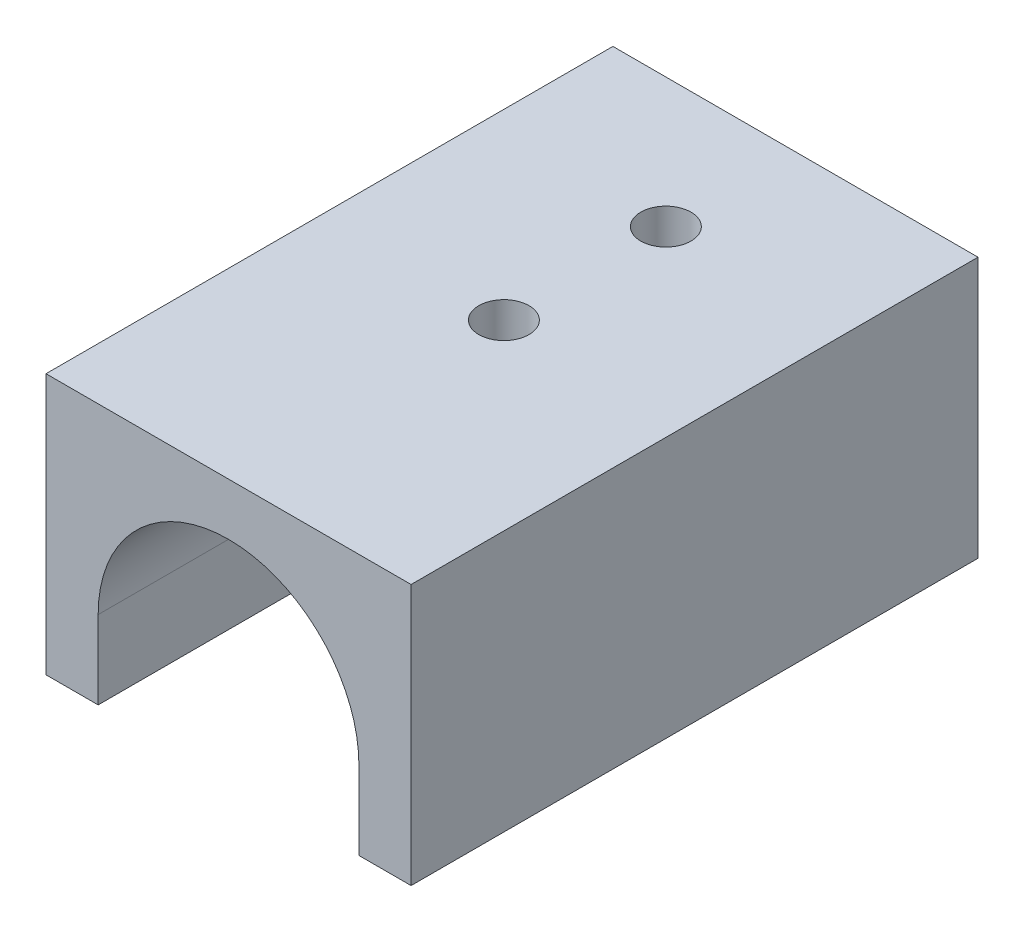
ISO-10303-21;
HEADER;
FILE_DESCRIPTION(('STEP AP214'),'2;1');
FILE_NAME('part.step','',(''),(''),'','','');
FILE_SCHEMA(('AUTOMOTIVE_DESIGN { 1 0 10303 214 1 1 1 1 }'));
ENDSEC;
DATA;
#1=APPLICATION_CONTEXT('core data for automotive mechanical design processes');
#2=APPLICATION_PROTOCOL_DEFINITION('international standard','automotive_design',2000,#1);
#3=PRODUCT_CONTEXT('',#1,'mechanical');
#4=PRODUCT('Part','Part','',(#3));
#5=PRODUCT_RELATED_PRODUCT_CATEGORY('part','',(#4));
#6=PRODUCT_DEFINITION_FORMATION('','',#4);
#7=PRODUCT_DEFINITION_CONTEXT('part definition',#1,'design');
#8=PRODUCT_DEFINITION('design','',#6,#7);
#9=PRODUCT_DEFINITION_SHAPE('','',#8);
#10=(LENGTH_UNIT() NAMED_UNIT(*) SI_UNIT(.MILLI.,.METRE.));
#11=(NAMED_UNIT(*) PLANE_ANGLE_UNIT() SI_UNIT($,.RADIAN.));
#12=(NAMED_UNIT(*) SI_UNIT($,.STERADIAN.) SOLID_ANGLE_UNIT());
#13=UNCERTAINTY_MEASURE_WITH_UNIT(LENGTH_MEASURE(1.E-05),#10,'distance_accuracy_value','');
#14=(GEOMETRIC_REPRESENTATION_CONTEXT(3) GLOBAL_UNCERTAINTY_ASSIGNED_CONTEXT((#13)) GLOBAL_UNIT_ASSIGNED_CONTEXT((#10,
#11,#12)) REPRESENTATION_CONTEXT('',''));
#15=CARTESIAN_POINT('',(0.,0.,0.));
#16=DIRECTION('',(0.,0.,1.));
#17=DIRECTION('',(1.,0.,0.));
#18=AXIS2_PLACEMENT_3D('',#15,#16,#17);
#19=CARTESIAN_POINT('',(-11.27,11.27,17.5));
#20=DIRECTION('',(1.,0.,0.));
#21=DIRECTION('',(0.,0.,-1.));
#22=AXIS2_PLACEMENT_3D('',#19,#20,#21);
#23=PLANE('',#22);
#24=DIRECTION('',(0.,-1.,0.));
#25=VECTOR('',#24,1.);
#26=CARTESIAN_POINT('',(-11.27,11.27,-17.5));
#27=LINE('',#26,#25);
#28=CARTESIAN_POINT('',(-11.27,11.27,-17.5));
#29=VERTEX_POINT('',#28);
#30=CARTESIAN_POINT('',(-11.27,-4.83,-17.5));
#31=VERTEX_POINT('',#30);
#32=EDGE_CURVE('E129',#29,#31,#27,.T.);
#33=ORIENTED_EDGE('',*,*,#32,.T.);
#34=DIRECTION('',(0.,0.,-1.));
#35=VECTOR('',#34,1.);
#36=CARTESIAN_POINT('',(-11.27,-4.83,17.5));
#37=LINE('',#36,#35);
#38=CARTESIAN_POINT('',(-11.27,-4.83,17.5));
#39=VERTEX_POINT('',#38);
#40=EDGE_CURVE('E11',#39,#31,#37,.T.);
#41=ORIENTED_EDGE('',*,*,#40,.F.);
#42=DIRECTION('',(0.,-1.,0.));
#43=VECTOR('',#42,1.);
#44=CARTESIAN_POINT('',(-11.27,11.27,17.5));
#45=LINE('',#44,#43);
#46=CARTESIAN_POINT('',(-11.27,11.27,17.5));
#47=VERTEX_POINT('',#46);
#48=EDGE_CURVE('E144',#47,#39,#45,.T.);
#49=ORIENTED_EDGE('',*,*,#48,.F.);
#50=DIRECTION('',(0.,0.,-1.));
#51=VECTOR('',#50,1.);
#52=CARTESIAN_POINT('',(-11.27,11.27,17.5));
#53=LINE('',#52,#51);
#54=EDGE_CURVE('E125',#47,#29,#53,.T.);
#55=ORIENTED_EDGE('',*,*,#54,.T.);
#56=EDGE_LOOP('',(#33,#41,#49,#55));
#57=FACE_BOUND('',#56,.T.);
#58=ADVANCED_FACE('F33',(#57),#23,.F.);
#59=CARTESIAN_POINT('',(-11.27,-4.83,17.5));
#60=DIRECTION('',(0.,1.,0.));
#61=DIRECTION('',(0.,0.,1.));
#62=AXIS2_PLACEMENT_3D('',#59,#60,#61);
#63=PLANE('',#62);
#64=DIRECTION('',(1.,0.,0.));
#65=VECTOR('',#64,1.);
#66=CARTESIAN_POINT('',(-11.27,-4.83,-17.5));
#67=LINE('',#66,#65);
#68=CARTESIAN_POINT('',(-8.05,-4.83,-17.5));
#69=VERTEX_POINT('',#68);
#70=EDGE_CURVE('E132',#31,#69,#67,.T.);
#71=ORIENTED_EDGE('',*,*,#70,.T.);
#72=DIRECTION('',(0.,0.,-1.));
#73=VECTOR('',#72,1.);
#74=CARTESIAN_POINT('',(-8.05,-4.83,17.5));
#75=LINE('',#74,#73);
#76=CARTESIAN_POINT('',(-8.05,-4.83,17.5));
#77=VERTEX_POINT('',#76);
#78=EDGE_CURVE('E41',#77,#69,#75,.T.);
#79=ORIENTED_EDGE('',*,*,#78,.F.);
#80=DIRECTION('',(1.,0.,0.));
#81=VECTOR('',#80,1.);
#82=CARTESIAN_POINT('',(-11.27,-4.83,17.5));
#83=LINE('',#82,#81);
#84=EDGE_CURVE('E92',#39,#77,#83,.T.);
#85=ORIENTED_EDGE('',*,*,#84,.F.);
#86=ORIENTED_EDGE('',*,*,#40,.T.);
#87=EDGE_LOOP('',(#71,#79,#85,#86));
#88=FACE_BOUND('',#87,.T.);
#89=ADVANCED_FACE('F211',(#88),#63,.F.);
#90=CARTESIAN_POINT('',(-8.05,-4.83,17.5));
#91=DIRECTION('',(-1.,0.,0.));
#92=DIRECTION('',(0.,-1.,0.));
#93=AXIS2_PLACEMENT_3D('',#90,#91,#92);
#94=PLANE('',#93);
#95=DIRECTION('',(0.,1.,0.));
#96=VECTOR('',#95,1.);
#97=CARTESIAN_POINT('',(-8.05,-4.83,-17.5));
#98=LINE('',#97,#96);
#99=CARTESIAN_POINT('',(-8.05,0.,-17.5));
#100=VERTEX_POINT('',#99);
#101=EDGE_CURVE('E135',#69,#100,#98,.T.);
#102=ORIENTED_EDGE('',*,*,#101,.T.);
#103=DIRECTION('',(0.,0.,-1.));
#104=VECTOR('',#103,1.);
#105=CARTESIAN_POINT('',(-8.05,0.,17.5));
#106=LINE('',#105,#104);
#107=CARTESIAN_POINT('',(-8.05,0.,17.5));
#108=VERTEX_POINT('',#107);
#109=EDGE_CURVE('E151',#108,#100,#106,.T.);
#110=ORIENTED_EDGE('',*,*,#109,.F.);
#111=DIRECTION('',(0.,1.,0.));
#112=VECTOR('',#111,1.);
#113=CARTESIAN_POINT('',(-8.05,-4.83,17.5));
#114=LINE('',#113,#112);
#115=EDGE_CURVE('E159',#77,#108,#114,.T.);
#116=ORIENTED_EDGE('',*,*,#115,.F.);
#117=ORIENTED_EDGE('',*,*,#78,.T.);
#118=EDGE_LOOP('',(#102,#110,#116,#117));
#119=FACE_BOUND('',#118,.T.);
#120=ADVANCED_FACE('F157',(#119),#94,.F.);
#121=CARTESIAN_POINT('',(0.,0.,17.5));
#122=DIRECTION('',(0.,0.,-1.));
#123=DIRECTION('',(-1.,0.,0.));
#124=AXIS2_PLACEMENT_3D('',#121,#122,#123);
#125=CYLINDRICAL_SURFACE('',#124,8.05);
#126=CARTESIAN_POINT('',(0.,8.05,-7.95));
#127=CARTESIAN_POINT('',(-0.0862105618547308,8.04999842535356,-7.95000324717469));
#128=CARTESIAN_POINT('',(-0.172462890865495,8.04860084138752,-7.95721681458772));
#129=CARTESIAN_POINT('',(-0.342534050927733,8.04316034808383,-7.9858601955511));
#130=CARTESIAN_POINT('',(-0.426350816436114,8.03911525812303,-8.00730172819297));
#131=CARTESIAN_POINT('',(-0.589066917277874,8.028831929586,-8.06371776058672));
#132=CARTESIAN_POINT('',(-0.667970722481068,8.02259571988153,-8.0986797440539));
#133=CARTESIAN_POINT('',(-0.818785982822765,8.00860992717729,-8.18110804014874));
#134=CARTESIAN_POINT('',(-0.890697943867393,8.00086045379441,-8.22857344714786));
#135=CARTESIAN_POINT('',(-1.02640068852056,7.98459335824925,-8.33529565296864));
#136=CARTESIAN_POINT('',(-1.09009066940898,7.97606805460606,-8.39467946974094));
#137=CARTESIAN_POINT('',(-1.20666916890539,7.95926671598186,-8.52327964564308));
#138=CARTESIAN_POINT('',(-1.2595568853207,7.95099069955217,-8.59249673436004));
#139=CARTESIAN_POINT('',(-1.35345272022025,7.93555017933453,-8.73951606264995));
#140=CARTESIAN_POINT('',(-1.39435756907978,7.92839557164992,-8.81738538772583));
#141=CARTESIAN_POINT('',(-1.46246524601047,7.91611651970756,-8.97905181644173));
#142=CARTESIAN_POINT('',(-1.48966932346081,7.91099189034433,-9.0628483787794));
#143=CARTESIAN_POINT('',(-1.52927823684157,7.90343050153308,-9.23290963468623));
#144=CARTESIAN_POINT('',(-1.54185929407301,7.9009617636582,-9.31913183425275));
#145=CARTESIAN_POINT('',(-1.55241216873096,7.89889532870698,-9.49249588874146));
#146=CARTESIAN_POINT('',(-1.55038536876949,7.89929735991657,-9.57963765584838));
#147=CARTESIAN_POINT('',(-1.53192279014981,7.90289794765431,-9.75108554299766));
#148=CARTESIAN_POINT('',(-1.51568803902102,7.90605748665065,-9.83541425184964));
#149=CARTESIAN_POINT('',(-1.46958727888704,7.91475574431484,-10.0001282523838));
#150=CARTESIAN_POINT('',(-1.43972066209151,7.92029456906488,-10.08051336806));
#151=CARTESIAN_POINT('',(-1.36700922262734,7.93316774424294,-10.2356430254333));
#152=CARTESIAN_POINT('',(-1.32408382034174,7.94051318696532,-10.310348839801));
#153=CARTESIAN_POINT('',(-1.22653023954093,7.95616470245715,-10.4515728150637));
#154=CARTESIAN_POINT('',(-1.1719008108292,7.96447087780617,-10.5180901000832));
#155=CARTESIAN_POINT('',(-1.05140903517778,7.98127758544892,-10.6422097252475));
#156=CARTESIAN_POINT('',(-0.985374888627045,7.98977905185996,-10.699645290741));
#157=CARTESIAN_POINT('',(-0.844521444261749,8.00589159406762,-10.8026495381875));
#158=CARTESIAN_POINT('',(-0.769702049016871,8.01350265998762,-10.8482180885146));
#159=CARTESIAN_POINT('',(-0.613223518097822,8.02699349400927,-10.9262218345862));
#160=CARTESIAN_POINT('',(-0.53155517830898,8.03287088278746,-10.9586390038627));
#161=CARTESIAN_POINT('',(-0.363793654511978,8.04221389056684,-11.0092475283378));
#162=CARTESIAN_POINT('',(-0.277700967790043,8.045679779981,-11.0274404785945));
#163=CARTESIAN_POINT('',(-0.104968765806848,8.04977192897762,-11.0488504237753));
#164=CARTESIAN_POINT('',(-0.0183585534198852,8.05044149171355,-11.0522958164239));
#165=CARTESIAN_POINT('',(0.15420023036194,8.04898542476023,-11.044726469398));
#166=CARTESIAN_POINT('',(0.240148835881382,8.04685994021979,-11.0337124806095));
#167=CARTESIAN_POINT('',(0.408215286186795,8.04007961834028,-10.9977268561192));
#168=CARTESIAN_POINT('',(0.490358938090241,8.03544584944033,-10.9728714327875));
#169=CARTESIAN_POINT('',(0.649312942020345,8.0241664748914,-10.9100347408302));
#170=CARTESIAN_POINT('',(0.726122916304132,8.01752072692788,-10.8720525436737));
#171=CARTESIAN_POINT('',(0.873199403178565,8.00284659026074,-10.7835394954193));
#172=CARTESIAN_POINT('',(0.943380891661179,7.99480323692781,-10.7328698974978));
#173=CARTESIAN_POINT('',(1.07432694460329,7.97826331559568,-10.6206073358215));
#174=CARTESIAN_POINT('',(1.13509057720513,7.96976670286001,-10.5590132924298));
#175=CARTESIAN_POINT('',(1.24634935107676,7.95313330642179,-10.4256139530047));
#176=CARTESIAN_POINT('',(1.29668825024846,7.94500325431531,-10.353677365463));
#177=CARTESIAN_POINT('',(1.38456819679623,7.93016174865427,-10.202235185184));
#178=CARTESIAN_POINT('',(1.42210973514521,7.92345024068077,-10.1227298829716));
#179=CARTESIAN_POINT('',(1.48311101600777,7.91225916384547,-9.95879339032262));
#180=CARTESIAN_POINT('',(1.50664077785396,7.90776851638355,-9.87438904621588));
#181=CARTESIAN_POINT('',(1.53916515711876,7.90150301105244,-9.70272983838665));
#182=CARTESIAN_POINT('',(1.54816151480488,7.89972782802785,-9.61547531722848));
#183=CARTESIAN_POINT('',(1.55130301849039,7.89911135872095,-9.44215904727128));
#184=CARTESIAN_POINT('',(1.54569478656281,7.9002213510029,-9.35610184612318));
#185=CARTESIAN_POINT('',(1.52032797718634,7.90514180299883,-9.18618163442649));
#186=CARTESIAN_POINT('',(1.50056949546241,7.90895224444456,-9.10231860903851));
#187=CARTESIAN_POINT('',(1.44756949973569,7.91882323078578,-8.93930959896446));
#188=CARTESIAN_POINT('',(1.41435609646211,7.92487908223142,-8.8601541719256));
#189=CARTESIAN_POINT('',(1.33541655023485,7.93856160380259,-8.70850017041187));
#190=CARTESIAN_POINT('',(1.28968945712629,7.94618839319738,-8.63600210198362));
#191=CARTESIAN_POINT('',(1.18616912257707,7.96230382716423,-8.49848828820187));
#192=CARTESIAN_POINT('',(1.12819693843106,7.97080416830911,-8.43360859784963));
#193=CARTESIAN_POINT('',(1.00220374432662,7.98762285089128,-8.31441606233843));
#194=CARTESIAN_POINT('',(0.934180429347513,7.99594115007725,-8.26010564766332));
#195=CARTESIAN_POINT('',(0.789234632229584,8.01155212364198,-8.16310541273832));
#196=CARTESIAN_POINT('',(0.712233183384229,8.01883421603446,-8.12053182822813));
#197=CARTESIAN_POINT('',(0.55205312901201,8.03144865279726,-8.04899468822523));
#198=CARTESIAN_POINT('',(0.46888031584701,8.03678279831651,-8.02001855288875));
#199=CARTESIAN_POINT('',(0.321237841660569,8.04383306018301,-7.98227498111332));
#200=CARTESIAN_POINT('',(0.25762259056929,8.04613241567164,-7.970192899384));
#201=CARTESIAN_POINT('',(0.129346044698939,8.04921645521134,-7.95405430246493));
#202=CARTESIAN_POINT('',(0.0646847791231241,8.05000118147539,-7.94999756360737));
#203=CARTESIAN_POINT('',(0.,8.05,-7.95));
#204=B_SPLINE_CURVE_WITH_KNOTS('',3,(#126,#127,#128,#129,#130,#131,#132,#133,#134,#135,#136,
#137,#138,#139,#140,#141,#142,#143,#144,#145,#146,#147,#148,#149,#150,#151,#152,#153,#154,#155,
#156,#157,#158,#159,#160,#161,#162,#163,#164,#165,#166,#167,#168,#169,#170,#171,#172,#173,#174,
#175,#176,#177,#178,#179,#180,#181,#182,#183,#184,#185,#186,#187,#188,#189,#190,#191,#192,#193,
#194,#195,#196,#197,#198,#199,#200,#201,#202,#203),.UNSPECIFIED.,.T.,.F.,(4,2,2,2,2,2,2,2,2,2,2,
2,2,2,2,2,2,2,2,2,2,2,2,2,2,2,2,2,2,2,2,2,2,2,2,2,2,2,4),(0.,0.258395097758879,
0.517003291398923,0.775372654596524,1.03372330912911,1.29498937540572,1.55627483665118,
1.81974996392261,2.0832010604327,2.34344327917453,2.60366086669988,2.86025511332621,
3.11686080158136,3.37508315303579,3.63333310095805,3.89588060704474,4.15843102511524,
4.4213401123389,4.68421971355392,4.94301298323726,5.20179281413224,5.45843199865001,
5.71508934042511,5.97468638226007,6.23430909376672,6.49757896026993,6.7608387252428,
7.02277164761484,7.28467320313388,7.54218091763953,7.79968689014896,8.05665761966075,
8.31364786617932,8.57469161207224,8.83579531617429,9.09939886830187,9.36275806126957,
9.55664028768916,9.75051711049882),.UNSPECIFIED.);
#205=CARTESIAN_POINT('',(0.,8.05,-7.95));
#206=VERTEX_POINT('',#205);
#207=EDGE_CURVE('E133',#206,#206,#204,.T.);
#208=ORIENTED_EDGE('',*,*,#207,.F.);
#209=EDGE_LOOP('',(#208));
#210=FACE_BOUND('',#209,.T.);
#211=CARTESIAN_POINT('',(0.,8.05,2.05));
#212=CARTESIAN_POINT('',(-0.0862105618547307,8.04999842535356,2.04999675282531));
#213=CARTESIAN_POINT('',(-0.172462890865495,8.04860084138752,2.04278318541228));
#214=CARTESIAN_POINT('',(-0.342534050927733,8.04316034808383,2.0141398044489));
#215=CARTESIAN_POINT('',(-0.426350816436114,8.03911525812303,1.99269827180703));
#216=CARTESIAN_POINT('',(-0.589066917277875,8.028831929586,1.93628223941328));
#217=CARTESIAN_POINT('',(-0.667970722481069,8.02259571988153,1.9013202559461));
#218=CARTESIAN_POINT('',(-0.818785982822765,8.00860992717729,1.81889195985126));
#219=CARTESIAN_POINT('',(-0.890697943867394,8.00086045379441,1.77142655285214));
#220=CARTESIAN_POINT('',(-1.02640068852057,7.98459335824925,1.66470434703136));
#221=CARTESIAN_POINT('',(-1.09009066940899,7.97606805460606,1.60532053025906));
#222=CARTESIAN_POINT('',(-1.20666916890539,7.95926671598186,1.47672035435692));
#223=CARTESIAN_POINT('',(-1.2595568853207,7.95099069955217,1.40750326563996));
#224=CARTESIAN_POINT('',(-1.35345272022025,7.93555017933453,1.26048393735005));
#225=CARTESIAN_POINT('',(-1.39435756907978,7.92839557164992,1.18261461227417));
#226=CARTESIAN_POINT('',(-1.46246524601047,7.91611651970756,1.02094818355827));
#227=CARTESIAN_POINT('',(-1.48966932346081,7.91099189034433,0.937151621220598));
#228=CARTESIAN_POINT('',(-1.52927823684157,7.90343050153308,0.767090365313776));
#229=CARTESIAN_POINT('',(-1.54185929407301,7.9009617636582,0.680868165747249));
#230=CARTESIAN_POINT('',(-1.55241216873096,7.89889532870698,0.507504111258543));
#231=CARTESIAN_POINT('',(-1.55038536876949,7.89929735991657,0.420362344151623));
#232=CARTESIAN_POINT('',(-1.53192279014981,7.90289794765431,0.248914457002344));
#233=CARTESIAN_POINT('',(-1.51568803902102,7.90605748665065,0.164585748150363));
#234=CARTESIAN_POINT('',(-1.46958727888704,7.91475574431484,-0.000128252383841524));
#235=CARTESIAN_POINT('',(-1.43972066209151,7.92029456906488,-0.0805133680600187));
#236=CARTESIAN_POINT('',(-1.36700922262734,7.93316774424294,-0.2356430254333));
#237=CARTESIAN_POINT('',(-1.32408382034174,7.94051318696532,-0.310348839801029));
#238=CARTESIAN_POINT('',(-1.22653023954093,7.95616470245715,-0.451572815063736));
#239=CARTESIAN_POINT('',(-1.1719008108292,7.96447087780617,-0.51809010008317));
#240=CARTESIAN_POINT('',(-1.05140903517778,7.98127758544892,-0.642209725247495));
#241=CARTESIAN_POINT('',(-0.985374888627045,7.98977905185996,-0.699645290741006));
#242=CARTESIAN_POINT('',(-0.84452144426175,8.00589159406762,-0.802649538187484));
#243=CARTESIAN_POINT('',(-0.769702049016872,8.01350265998762,-0.848218088514644));
#244=CARTESIAN_POINT('',(-0.613223518097822,8.02699349400927,-0.926221834586208));
#245=CARTESIAN_POINT('',(-0.531555178308979,8.03287088278746,-0.958639003862689));
#246=CARTESIAN_POINT('',(-0.363793654511978,8.04221389056684,-1.00924752833778));
#247=CARTESIAN_POINT('',(-0.277700967790042,8.045679779981,-1.02744047859451));
#248=CARTESIAN_POINT('',(-0.104968765806848,8.04977192897762,-1.04885042377525));
#249=CARTESIAN_POINT('',(-0.0183585534198846,8.05044149171355,-1.0522958164239));
#250=CARTESIAN_POINT('',(0.154200230361941,8.04898542476023,-1.044726469398));
#251=CARTESIAN_POINT('',(0.240148835881382,8.04685994021979,-1.0337124806095));
#252=CARTESIAN_POINT('',(0.408215286186795,8.04007961834028,-0.997726856119196));
#253=CARTESIAN_POINT('',(0.490358938090241,8.03544584944033,-0.972871432787522));
#254=CARTESIAN_POINT('',(0.649312942020345,8.0241664748914,-0.910034740830219));
#255=CARTESIAN_POINT('',(0.726122916304132,8.01752072692788,-0.872052543673659));
#256=CARTESIAN_POINT('',(0.873199403178566,8.00284659026074,-0.783539495419317));
#257=CARTESIAN_POINT('',(0.943380891661181,7.99480323692781,-0.732869897497753));
#258=CARTESIAN_POINT('',(1.07432694460329,7.97826331559568,-0.620607335821531));
#259=CARTESIAN_POINT('',(1.13509057720513,7.96976670286001,-0.559013292429762));
#260=CARTESIAN_POINT('',(1.24634935107675,7.95313330642179,-0.425613953004681));
#261=CARTESIAN_POINT('',(1.29668825024847,7.94500325431531,-0.353677365462963));
#262=CARTESIAN_POINT('',(1.38456819679623,7.93016174865427,-0.202235185184016));
#263=CARTESIAN_POINT('',(1.42210973514521,7.92345024068077,-0.122729882971558));
#264=CARTESIAN_POINT('',(1.48311101600777,7.91225916384547,0.041206609677379));
#265=CARTESIAN_POINT('',(1.50664077785396,7.90776851638355,0.125610953784121));
#266=CARTESIAN_POINT('',(1.53916515711876,7.90150301105244,0.297270161613347));
#267=CARTESIAN_POINT('',(1.54816151480488,7.89972782802785,0.384524682771519));
#268=CARTESIAN_POINT('',(1.55130301849039,7.89911135872095,0.55784095272872));
#269=CARTESIAN_POINT('',(1.54569478656281,7.9002213510029,0.643898153876821));
#270=CARTESIAN_POINT('',(1.52032797718634,7.90514180299883,0.813818365573511));
#271=CARTESIAN_POINT('',(1.50056949546241,7.90895224444456,0.89768139096149));
#272=CARTESIAN_POINT('',(1.44756949973569,7.91882323078578,1.06069040103554));
#273=CARTESIAN_POINT('',(1.41435609646211,7.92487908223142,1.1398458280744));
#274=CARTESIAN_POINT('',(1.33541655023485,7.93856160380259,1.29149982958813));
#275=CARTESIAN_POINT('',(1.28968945712629,7.94618839319738,1.36399789801638));
#276=CARTESIAN_POINT('',(1.18616912257707,7.96230382716423,1.50151171179813));
#277=CARTESIAN_POINT('',(1.12819693843106,7.97080416830911,1.56639140215037));
#278=CARTESIAN_POINT('',(1.00220374432662,7.98762285089128,1.68558393766158));
#279=CARTESIAN_POINT('',(0.934180429347512,7.99594115007725,1.73989435233668));
#280=CARTESIAN_POINT('',(0.789234632229584,8.01155212364198,1.83689458726168));
#281=CARTESIAN_POINT('',(0.71223318338423,8.01883421603446,1.87946817177187));
#282=CARTESIAN_POINT('',(0.552053129012011,8.03144865279726,1.95100531177477));
#283=CARTESIAN_POINT('',(0.468880315847011,8.03678279831651,1.97998144711125));
#284=CARTESIAN_POINT('',(0.321237841660569,8.04383306018301,2.01772501888668));
#285=CARTESIAN_POINT('',(0.25762259056929,8.04613241567164,2.029807100616));
#286=CARTESIAN_POINT('',(0.129346044698938,8.04921645521134,2.04594569753507));
#287=CARTESIAN_POINT('',(0.0646847791231237,8.05000118147539,2.05000243639263));
#288=CARTESIAN_POINT('',(0.,8.05,2.05));
#289=B_SPLINE_CURVE_WITH_KNOTS('',3,(#211,#212,#213,#214,#215,#216,#217,#218,#219,#220,#221,
#222,#223,#224,#225,#226,#227,#228,#229,#230,#231,#232,#233,#234,#235,#236,#237,#238,#239,#240,
#241,#242,#243,#244,#245,#246,#247,#248,#249,#250,#251,#252,#253,#254,#255,#256,#257,#258,#259,
#260,#261,#262,#263,#264,#265,#266,#267,#268,#269,#270,#271,#272,#273,#274,#275,#276,#277,#278,
#279,#280,#281,#282,#283,#284,#285,#286,#287,#288),.UNSPECIFIED.,.T.,.F.,(4,2,2,2,2,2,2,2,2,2,2,
2,2,2,2,2,2,2,2,2,2,2,2,2,2,2,2,2,2,2,2,2,2,2,2,2,2,2,4),(0.,0.258395097758879,
0.517003291398924,0.775372654596525,1.03372330912911,1.29498937540572,1.55627483665118,
1.81974996392261,2.0832010604327,2.34344327917452,2.60366086669989,2.86025511332621,
3.11686080158136,3.37508315303579,3.63333310095805,3.89588060704474,4.15843102511524,
4.4213401123389,4.68421971355393,4.94301298323726,5.20179281413224,5.45843199865001,
5.71508934042512,5.97468638226008,6.23430909376672,6.49757896026993,6.7608387252428,
7.02277164761484,7.28467320313388,7.54218091763953,7.79968689014896,8.05665761966075,
8.31364786617932,8.57469161207224,8.83579531617429,9.09939886830187,9.36275806126957,
9.55664028768916,9.75051711049882),.UNSPECIFIED.);
#290=CARTESIAN_POINT('',(0.,8.05,2.05));
#291=VERTEX_POINT('',#290);
#292=EDGE_CURVE('E177',#291,#291,#289,.T.);
#293=ORIENTED_EDGE('',*,*,#292,.F.);
#294=EDGE_LOOP('',(#293));
#295=FACE_BOUND('',#294,.T.);
#296=CARTESIAN_POINT('',(0.,0.,-17.5));
#297=DIRECTION('',(0.,0.,-1.));
#298=DIRECTION('',(-1.,0.,0.));
#299=AXIS2_PLACEMENT_3D('',#296,#297,#298);
#300=CIRCLE('',#299,8.05);
#301=CARTESIAN_POINT('',(8.05,0.,-17.5));
#302=VERTEX_POINT('',#301);
#303=EDGE_CURVE('E137',#100,#302,#300,.T.);
#304=ORIENTED_EDGE('',*,*,#303,.T.);
#305=DIRECTION('',(0.,0.,-1.));
#306=VECTOR('',#305,1.);
#307=CARTESIAN_POINT('',(8.05,0.,17.5));
#308=LINE('',#307,#306);
#309=CARTESIAN_POINT('',(8.05,0.,17.5));
#310=VERTEX_POINT('',#309);
#311=EDGE_CURVE('E148',#310,#302,#308,.T.);
#312=ORIENTED_EDGE('',*,*,#311,.F.);
#313=CARTESIAN_POINT('',(0.,0.,17.5));
#314=DIRECTION('',(0.,0.,-1.));
#315=DIRECTION('',(-1.,0.,0.));
#316=AXIS2_PLACEMENT_3D('',#313,#314,#315);
#317=CIRCLE('',#316,8.05);
#318=EDGE_CURVE('E171',#108,#310,#317,.T.);
#319=ORIENTED_EDGE('',*,*,#318,.F.);
#320=ORIENTED_EDGE('',*,*,#109,.T.);
#321=EDGE_LOOP('',(#304,#312,#319,#320));
#322=FACE_BOUND('',#321,.T.);
#323=ADVANCED_FACE('F167',(#210,#295,#322),#125,.F.);
#324=CARTESIAN_POINT('',(8.05,-4.83,17.5));
#325=DIRECTION('',(1.,0.,0.));
#326=DIRECTION('',(0.,1.,0.));
#327=AXIS2_PLACEMENT_3D('',#324,#325,#326);
#328=PLANE('',#327);
#329=DIRECTION('',(0.,-1.,0.));
#330=VECTOR('',#329,1.);
#331=CARTESIAN_POINT('',(8.05,-4.83,-17.5));
#332=LINE('',#331,#330);
#333=CARTESIAN_POINT('',(8.05,-4.83,-17.5));
#334=VERTEX_POINT('',#333);
#335=EDGE_CURVE('E139',#302,#334,#332,.T.);
#336=ORIENTED_EDGE('',*,*,#335,.T.);
#337=DIRECTION('',(0.,0.,-1.));
#338=VECTOR('',#337,1.);
#339=CARTESIAN_POINT('',(8.05,-4.83,17.5));
#340=LINE('',#339,#338);
#341=CARTESIAN_POINT('',(8.05,-4.83,17.5));
#342=VERTEX_POINT('',#341);
#343=EDGE_CURVE('E120',#342,#334,#340,.T.);
#344=ORIENTED_EDGE('',*,*,#343,.F.);
#345=DIRECTION('',(0.,-1.,0.));
#346=VECTOR('',#345,1.);
#347=CARTESIAN_POINT('',(8.05,-4.83,17.5));
#348=LINE('',#347,#346);
#349=EDGE_CURVE('E111',#310,#342,#348,.T.);
#350=ORIENTED_EDGE('',*,*,#349,.F.);
#351=ORIENTED_EDGE('',*,*,#311,.T.);
#352=EDGE_LOOP('',(#336,#344,#350,#351));
#353=FACE_BOUND('',#352,.T.);
#354=ADVANCED_FACE('F170',(#353),#328,.F.);
#355=CARTESIAN_POINT('',(11.27,-4.83,17.5));
#356=DIRECTION('',(0.,1.,0.));
#357=DIRECTION('',(0.,0.,1.));
#358=AXIS2_PLACEMENT_3D('',#355,#356,#357);
#359=PLANE('',#358);
#360=DIRECTION('',(1.,0.,0.));
#361=VECTOR('',#360,1.);
#362=CARTESIAN_POINT('',(11.27,-4.83,-17.5));
#363=LINE('',#362,#361);
#364=CARTESIAN_POINT('',(11.27,-4.83,-17.5));
#365=VERTEX_POINT('',#364);
#366=EDGE_CURVE('E119',#334,#365,#363,.T.);
#367=ORIENTED_EDGE('',*,*,#366,.T.);
#368=DIRECTION('',(0.,0.,-1.));
#369=VECTOR('',#368,1.);
#370=CARTESIAN_POINT('',(11.27,-4.83,17.5));
#371=LINE('',#370,#369);
#372=CARTESIAN_POINT('',(11.27,-4.83,17.5));
#373=VERTEX_POINT('',#372);
#374=EDGE_CURVE('E116',#373,#365,#371,.T.);
#375=ORIENTED_EDGE('',*,*,#374,.F.);
#376=DIRECTION('',(1.,0.,0.));
#377=VECTOR('',#376,1.);
#378=CARTESIAN_POINT('',(11.27,-4.83,17.5));
#379=LINE('',#378,#377);
#380=EDGE_CURVE('E105',#342,#373,#379,.T.);
#381=ORIENTED_EDGE('',*,*,#380,.F.);
#382=ORIENTED_EDGE('',*,*,#343,.T.);
#383=EDGE_LOOP('',(#367,#375,#381,#382));
#384=FACE_BOUND('',#383,.T.);
#385=ADVANCED_FACE('F117',(#384),#359,.F.);
#386=CARTESIAN_POINT('',(11.27,11.27,17.5));
#387=DIRECTION('',(-1.,0.,0.));
#388=DIRECTION('',(0.,0.,1.));
#389=AXIS2_PLACEMENT_3D('',#386,#387,#388);
#390=PLANE('',#389);
#391=DIRECTION('',(0.,1.,0.));
#392=VECTOR('',#391,1.);
#393=CARTESIAN_POINT('',(11.27,11.27,-17.5));
#394=LINE('',#393,#392);
#395=CARTESIAN_POINT('',(11.27,11.27,-17.5));
#396=VERTEX_POINT('',#395);
#397=EDGE_CURVE('E78',#365,#396,#394,.T.);
#398=ORIENTED_EDGE('',*,*,#397,.T.);
#399=DIRECTION('',(0.,0.,-1.));
#400=VECTOR('',#399,1.);
#401=CARTESIAN_POINT('',(11.27,11.27,17.5));
#402=LINE('',#401,#400);
#403=CARTESIAN_POINT('',(11.27,11.27,17.5));
#404=VERTEX_POINT('',#403);
#405=EDGE_CURVE('E121',#404,#396,#402,.T.);
#406=ORIENTED_EDGE('',*,*,#405,.F.);
#407=DIRECTION('',(0.,1.,0.));
#408=VECTOR('',#407,1.);
#409=CARTESIAN_POINT('',(11.27,11.27,17.5));
#410=LINE('',#409,#408);
#411=EDGE_CURVE('E109',#373,#404,#410,.T.);
#412=ORIENTED_EDGE('',*,*,#411,.F.);
#413=ORIENTED_EDGE('',*,*,#374,.T.);
#414=EDGE_LOOP('',(#398,#406,#412,#413));
#415=FACE_BOUND('',#414,.T.);
#416=ADVANCED_FACE('F123',(#415),#390,.F.);
#417=CARTESIAN_POINT('',(-11.27,11.27,17.5));
#418=DIRECTION('',(0.,-1.,0.));
#419=DIRECTION('',(0.,0.,-1.));
#420=AXIS2_PLACEMENT_3D('',#417,#418,#419);
#421=PLANE('',#420);
#422=CARTESIAN_POINT('',(0.,11.27,-9.5));
#423=DIRECTION('',(0.,1.,0.));
#424=DIRECTION('',(0.,0.,1.));
#425=AXIS2_PLACEMENT_3D('',#422,#423,#424);
#426=CIRCLE('',#425,1.55);
#427=CARTESIAN_POINT('',(0.,11.27,-7.95));
#428=VERTEX_POINT('',#427);
#429=EDGE_CURVE('E185',#428,#428,#426,.T.);
#430=ORIENTED_EDGE('',*,*,#429,.F.);
#431=EDGE_LOOP('',(#430));
#432=FACE_BOUND('',#431,.T.);
#433=CARTESIAN_POINT('',(0.,11.27,0.499999999999999));
#434=DIRECTION('',(0.,1.,0.));
#435=DIRECTION('',(0.,0.,1.));
#436=AXIS2_PLACEMENT_3D('',#433,#434,#435);
#437=CIRCLE('',#436,1.55);
#438=CARTESIAN_POINT('',(0.,11.27,2.05));
#439=VERTEX_POINT('',#438);
#440=EDGE_CURVE('E186',#439,#439,#437,.T.);
#441=ORIENTED_EDGE('',*,*,#440,.F.);
#442=EDGE_LOOP('',(#441));
#443=FACE_BOUND('',#442,.T.);
#444=DIRECTION('',(-1.,0.,0.));
#445=VECTOR('',#444,1.);
#446=CARTESIAN_POINT('',(-11.27,11.27,-17.5));
#447=LINE('',#446,#445);
#448=EDGE_CURVE('E84',#396,#29,#447,.T.);
#449=ORIENTED_EDGE('',*,*,#448,.T.);
#450=ORIENTED_EDGE('',*,*,#54,.F.);
#451=DIRECTION('',(-1.,0.,0.));
#452=VECTOR('',#451,1.);
#453=CARTESIAN_POINT('',(-11.27,11.27,17.5));
#454=LINE('',#453,#452);
#455=EDGE_CURVE('E49',#404,#47,#454,.T.);
#456=ORIENTED_EDGE('',*,*,#455,.F.);
#457=ORIENTED_EDGE('',*,*,#405,.T.);
#458=EDGE_LOOP('',(#449,#450,#456,#457));
#459=FACE_BOUND('',#458,.T.);
#460=ADVANCED_FACE('F195',(#432,#443,#459),#421,.F.);
#461=CARTESIAN_POINT('',(0.,0.,17.5));
#462=DIRECTION('',(0.,0.,-1.));
#463=DIRECTION('',(-1.,0.,0.));
#464=AXIS2_PLACEMENT_3D('',#461,#462,#463);
#465=PLANE('',#464);
#466=ORIENTED_EDGE('',*,*,#48,.T.);
#467=ORIENTED_EDGE('',*,*,#84,.T.);
#468=ORIENTED_EDGE('',*,*,#115,.T.);
#469=ORIENTED_EDGE('',*,*,#318,.T.);
#470=ORIENTED_EDGE('',*,*,#349,.T.);
#471=ORIENTED_EDGE('',*,*,#380,.T.);
#472=ORIENTED_EDGE('',*,*,#411,.T.);
#473=ORIENTED_EDGE('',*,*,#455,.T.);
#474=EDGE_LOOP('',(#466,#467,#468,#469,#470,#471,#472,#473));
#475=FACE_BOUND('',#474,.T.);
#476=ADVANCED_FACE('F107',(#475),#465,.F.);
#477=CARTESIAN_POINT('',(0.,0.,-17.5));
#478=DIRECTION('',(0.,0.,-1.));
#479=DIRECTION('',(-1.,0.,0.));
#480=AXIS2_PLACEMENT_3D('',#477,#478,#479);
#481=PLANE('',#480);
#482=ORIENTED_EDGE('',*,*,#32,.F.);
#483=ORIENTED_EDGE('',*,*,#448,.F.);
#484=ORIENTED_EDGE('',*,*,#397,.F.);
#485=ORIENTED_EDGE('',*,*,#366,.F.);
#486=ORIENTED_EDGE('',*,*,#335,.F.);
#487=ORIENTED_EDGE('',*,*,#303,.F.);
#488=ORIENTED_EDGE('',*,*,#101,.F.);
#489=ORIENTED_EDGE('',*,*,#70,.F.);
#490=EDGE_LOOP('',(#482,#483,#484,#485,#486,#487,#488,#489));
#491=FACE_BOUND('',#490,.T.);
#492=ADVANCED_FACE('F163',(#491),#481,.T.);
#493=CARTESIAN_POINT('',(0.,-4.831,0.499999999999999));
#494=DIRECTION('',(0.,1.,0.));
#495=DIRECTION('',(0.,0.,1.));
#496=AXIS2_PLACEMENT_3D('',#493,#494,#495);
#497=CYLINDRICAL_SURFACE('',#496,1.55);
#498=ORIENTED_EDGE('',*,*,#292,.T.);
#499=EDGE_LOOP('',(#498));
#500=FACE_BOUND('',#499,.T.);
#501=ORIENTED_EDGE('',*,*,#440,.T.);
#502=EDGE_LOOP('',(#501));
#503=FACE_BOUND('',#502,.T.);
#504=ADVANCED_FACE('F188',(#500,#503),#497,.F.);
#505=CARTESIAN_POINT('',(0.,-4.831,-9.5));
#506=DIRECTION('',(0.,1.,0.));
#507=DIRECTION('',(0.,0.,1.));
#508=AXIS2_PLACEMENT_3D('',#505,#506,#507);
#509=CYLINDRICAL_SURFACE('',#508,1.55);
#510=ORIENTED_EDGE('',*,*,#207,.T.);
#511=EDGE_LOOP('',(#510));
#512=FACE_BOUND('',#511,.T.);
#513=ORIENTED_EDGE('',*,*,#429,.T.);
#514=EDGE_LOOP('',(#513));
#515=FACE_BOUND('',#514,.T.);
#516=ADVANCED_FACE('F282',(#512,#515),#509,.F.);
#517=CLOSED_SHELL('',(#58,#89,#120,#323,#354,#385,#416,#460,#476,#492,#504,#516));
#518=MANIFOLD_SOLID_BREP('B2',#517);
#519=ADVANCED_BREP_SHAPE_REPRESENTATION('',(#18,#518),#14);
#520=SHAPE_DEFINITION_REPRESENTATION(#9,#519);
ENDSEC;
END-ISO-10303-21;
